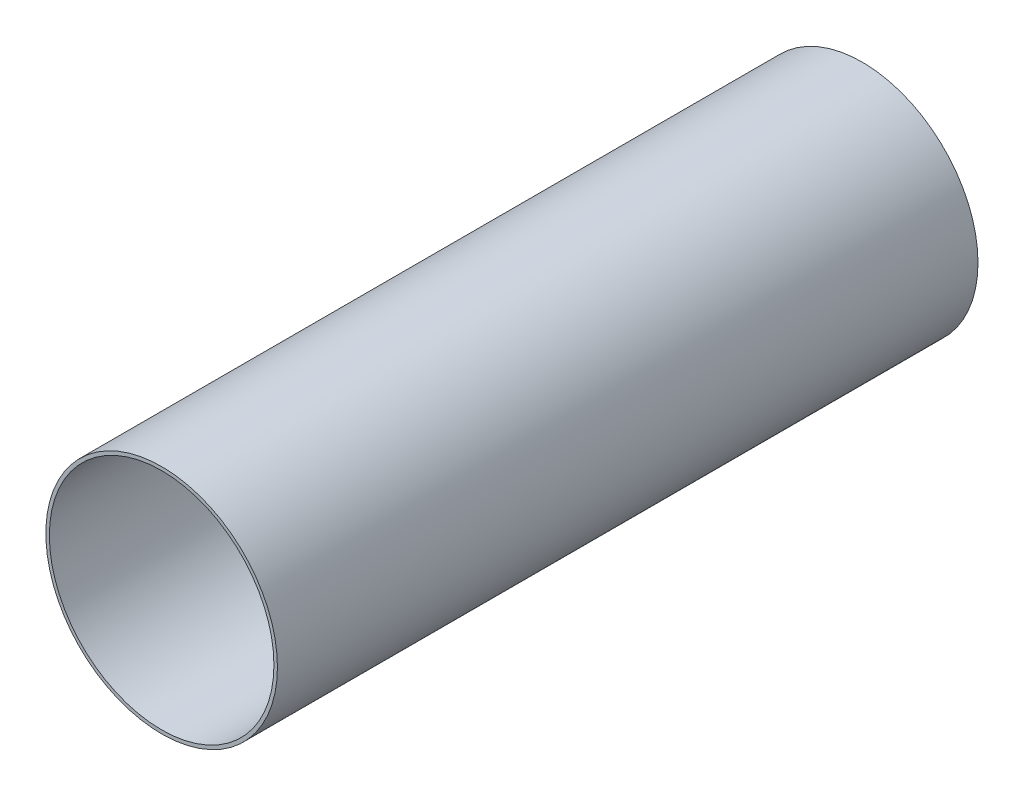
ISO-10303-21;
HEADER;
FILE_DESCRIPTION(('STEP AP214'),'2;1');
FILE_NAME('part.step','',(''),(''),'','','');
FILE_SCHEMA(('AUTOMOTIVE_DESIGN { 1 0 10303 214 1 1 1 1 }'));
ENDSEC;
DATA;
#1=APPLICATION_CONTEXT('core data for automotive mechanical design processes');
#2=APPLICATION_PROTOCOL_DEFINITION('international standard','automotive_design',2000,#1);
#3=PRODUCT_CONTEXT('',#1,'mechanical');
#4=PRODUCT('Part','Part','',(#3));
#5=PRODUCT_RELATED_PRODUCT_CATEGORY('part','',(#4));
#6=PRODUCT_DEFINITION_FORMATION('','',#4);
#7=PRODUCT_DEFINITION_CONTEXT('part definition',#1,'design');
#8=PRODUCT_DEFINITION('design','',#6,#7);
#9=PRODUCT_DEFINITION_SHAPE('','',#8);
#10=(LENGTH_UNIT() NAMED_UNIT(*) SI_UNIT(.MILLI.,.METRE.));
#11=(NAMED_UNIT(*) PLANE_ANGLE_UNIT() SI_UNIT($,.RADIAN.));
#12=(NAMED_UNIT(*) SI_UNIT($,.STERADIAN.) SOLID_ANGLE_UNIT());
#13=UNCERTAINTY_MEASURE_WITH_UNIT(LENGTH_MEASURE(1.E-05),#10,'distance_accuracy_value','');
#14=(GEOMETRIC_REPRESENTATION_CONTEXT(3) GLOBAL_UNCERTAINTY_ASSIGNED_CONTEXT((#13)) GLOBAL_UNIT_ASSIGNED_CONTEXT((#10,
#11,#12)) REPRESENTATION_CONTEXT('',''));
#15=CARTESIAN_POINT('',(0.,0.,0.));
#16=DIRECTION('',(0.,0.,1.));
#17=DIRECTION('',(1.,0.,0.));
#18=AXIS2_PLACEMENT_3D('',#15,#16,#17);
#19=CARTESIAN_POINT('',(0.,0.,288.879664728717));
#20=DIRECTION('',(0.,0.,-1.));
#21=DIRECTION('',(-1.,0.,0.));
#22=AXIS2_PLACEMENT_3D('',#19,#20,#21);
#23=CYLINDRICAL_SURFACE('',#22,32.5374);
#24=CARTESIAN_POINT('',(0.,0.,0.));
#25=DIRECTION('',(0.,0.,1.));
#26=DIRECTION('',(1.,0.,0.));
#27=AXIS2_PLACEMENT_3D('',#24,#25,#26);
#28=CIRCLE('',#27,32.5374);
#29=CARTESIAN_POINT('',(32.5374,0.,0.));
#30=VERTEX_POINT('',#29);
#31=EDGE_CURVE('E40',#30,#30,#28,.T.);
#32=ORIENTED_EDGE('',*,*,#31,.T.);
#33=EDGE_LOOP('',(#32));
#34=FACE_BOUND('',#33,.T.);
#35=CARTESIAN_POINT('',(0.,0.,196.85));
#36=DIRECTION('',(0.,0.,1.));
#37=DIRECTION('',(1.,0.,0.));
#38=AXIS2_PLACEMENT_3D('',#35,#36,#37);
#39=CIRCLE('',#38,32.5374);
#40=CARTESIAN_POINT('',(32.5374,0.,196.85));
#41=VERTEX_POINT('',#40);
#42=EDGE_CURVE('E10',#41,#41,#39,.T.);
#43=ORIENTED_EDGE('',*,*,#42,.F.);
#44=EDGE_LOOP('',(#43));
#45=FACE_BOUND('',#44,.T.);
#46=ADVANCED_FACE('F33',(#34,#45),#23,.T.);
#47=CARTESIAN_POINT('',(0.,0.,0.));
#48=DIRECTION('',(0.,0.,1.));
#49=DIRECTION('',(1.,0.,0.));
#50=AXIS2_PLACEMENT_3D('',#47,#48,#49);
#51=PLANE('',#50);
#52=ORIENTED_EDGE('',*,*,#31,.F.);
#53=EDGE_LOOP('',(#52));
#54=FACE_BOUND('',#53,.T.);
#55=CARTESIAN_POINT('',(0.,0.,0.));
#56=DIRECTION('',(0.,0.,1.));
#57=DIRECTION('',(1.,0.,0.));
#58=AXIS2_PLACEMENT_3D('',#55,#56,#57);
#59=CIRCLE('',#58,31.55315);
#60=CARTESIAN_POINT('',(31.55315,0.,0.));
#61=VERTEX_POINT('',#60);
#62=EDGE_CURVE('E45',#61,#61,#59,.T.);
#63=ORIENTED_EDGE('',*,*,#62,.T.);
#64=EDGE_LOOP('',(#63));
#65=FACE_BOUND('',#64,.T.);
#66=ADVANCED_FACE('F61',(#54,#65),#51,.F.);
#67=CARTESIAN_POINT('',(0.,0.,288.879664728717));
#68=DIRECTION('',(0.,0.,-1.));
#69=DIRECTION('',(-1.,0.,0.));
#70=AXIS2_PLACEMENT_3D('',#67,#68,#69);
#71=CYLINDRICAL_SURFACE('',#70,31.55315);
#72=ORIENTED_EDGE('',*,*,#62,.F.);
#73=EDGE_LOOP('',(#72));
#74=FACE_BOUND('',#73,.T.);
#75=CARTESIAN_POINT('',(0.,0.,196.85));
#76=DIRECTION('',(0.,0.,1.));
#77=DIRECTION('',(1.,0.,0.));
#78=AXIS2_PLACEMENT_3D('',#75,#76,#77);
#79=CIRCLE('',#78,31.55315);
#80=CARTESIAN_POINT('',(31.55315,0.,196.85));
#81=VERTEX_POINT('',#80);
#82=EDGE_CURVE('E36',#81,#81,#79,.T.);
#83=ORIENTED_EDGE('',*,*,#82,.T.);
#84=EDGE_LOOP('',(#83));
#85=FACE_BOUND('',#84,.T.);
#86=ADVANCED_FACE('F53',(#74,#85),#71,.F.);
#87=CARTESIAN_POINT('',(0.,0.,196.85));
#88=DIRECTION('',(0.,0.,1.));
#89=DIRECTION('',(0.,1.,0.));
#90=AXIS2_PLACEMENT_3D('',#87,#88,#89);
#91=PLANE('',#90);
#92=ORIENTED_EDGE('',*,*,#82,.F.);
#93=EDGE_LOOP('',(#92));
#94=FACE_BOUND('',#93,.T.);
#95=ORIENTED_EDGE('',*,*,#42,.T.);
#96=EDGE_LOOP('',(#95));
#97=FACE_BOUND('',#96,.T.);
#98=ADVANCED_FACE('F55',(#94,#97),#91,.T.);
#99=CLOSED_SHELL('',(#46,#66,#86,#98));
#100=MANIFOLD_SOLID_BREP('B2',#99);
#101=ADVANCED_BREP_SHAPE_REPRESENTATION('',(#18,#100),#14);
#102=SHAPE_DEFINITION_REPRESENTATION(#9,#101);
ENDSEC;
END-ISO-10303-21;
